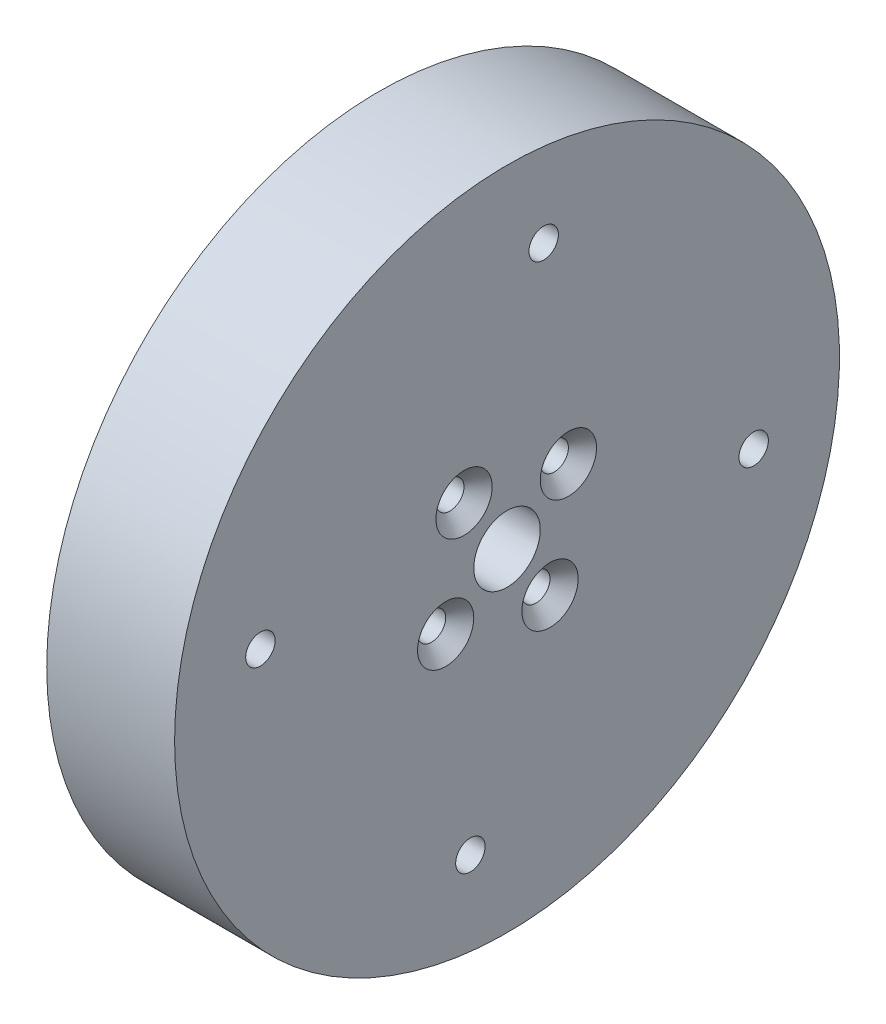
ISO-10303-21;
HEADER;
FILE_DESCRIPTION(('STEP AP214'),'2;1');
FILE_NAME('part.step','',(''),(''),'','','');
FILE_SCHEMA(('AUTOMOTIVE_DESIGN { 1 0 10303 214 1 1 1 1 }'));
ENDSEC;
DATA;
#1=APPLICATION_CONTEXT('core data for automotive mechanical design processes');
#2=APPLICATION_PROTOCOL_DEFINITION('international standard','automotive_design',2000,#1);
#3=PRODUCT_CONTEXT('',#1,'mechanical');
#4=PRODUCT('Part','Part','',(#3));
#5=PRODUCT_RELATED_PRODUCT_CATEGORY('part','',(#4));
#6=PRODUCT_DEFINITION_FORMATION('','',#4);
#7=PRODUCT_DEFINITION_CONTEXT('part definition',#1,'design');
#8=PRODUCT_DEFINITION('design','',#6,#7);
#9=PRODUCT_DEFINITION_SHAPE('','',#8);
#10=(LENGTH_UNIT() NAMED_UNIT(*) SI_UNIT(.MILLI.,.METRE.));
#11=(NAMED_UNIT(*) PLANE_ANGLE_UNIT() SI_UNIT($,.RADIAN.));
#12=(NAMED_UNIT(*) SI_UNIT($,.STERADIAN.) SOLID_ANGLE_UNIT());
#13=UNCERTAINTY_MEASURE_WITH_UNIT(LENGTH_MEASURE(1.E-05),#10,'distance_accuracy_value','');
#14=(GEOMETRIC_REPRESENTATION_CONTEXT(3) GLOBAL_UNCERTAINTY_ASSIGNED_CONTEXT((#13)) GLOBAL_UNIT_ASSIGNED_CONTEXT((#10,
#11,#12)) REPRESENTATION_CONTEXT('',''));
#15=CARTESIAN_POINT('',(0.,0.,0.));
#16=DIRECTION('',(0.,0.,1.));
#17=DIRECTION('',(1.,0.,0.));
#18=AXIS2_PLACEMENT_3D('',#15,#16,#17);
#19=CARTESIAN_POINT('',(0.,0.,0.));
#20=DIRECTION('',(-1.,0.,0.));
#21=DIRECTION('',(0.,0.,1.));
#22=AXIS2_PLACEMENT_3D('',#19,#20,#21);
#23=CYLINDRICAL_SURFACE('',#22,13.);
#24=CARTESIAN_POINT('',(5.,0.,0.));
#25=DIRECTION('',(-1.,0.,0.));
#26=DIRECTION('',(0.,0.,1.));
#27=AXIS2_PLACEMENT_3D('',#24,#25,#26);
#28=CIRCLE('',#27,13.);
#29=CARTESIAN_POINT('',(5.,0.,13.));
#30=VERTEX_POINT('',#29);
#31=EDGE_CURVE('E118',#30,#30,#28,.T.);
#32=ORIENTED_EDGE('',*,*,#31,.F.);
#33=EDGE_LOOP('',(#32));
#34=FACE_BOUND('',#33,.T.);
#35=CARTESIAN_POINT('',(0.,0.,0.));
#36=DIRECTION('',(-1.,0.,0.));
#37=DIRECTION('',(0.,0.,1.));
#38=AXIS2_PLACEMENT_3D('',#35,#36,#37);
#39=CIRCLE('',#38,13.);
#40=CARTESIAN_POINT('',(0.,0.,13.));
#41=VERTEX_POINT('',#40);
#42=EDGE_CURVE('E11',#41,#41,#39,.T.);
#43=ORIENTED_EDGE('',*,*,#42,.T.);
#44=EDGE_LOOP('',(#43));
#45=FACE_BOUND('',#44,.T.);
#46=ADVANCED_FACE('F36',(#34,#45),#23,.F.);
#47=CARTESIAN_POINT('',(0.,13.,0.));
#48=DIRECTION('',(1.,0.,0.));
#49=DIRECTION('',(0.,0.,-1.));
#50=AXIS2_PLACEMENT_3D('',#47,#48,#49);
#51=PLANE('',#50);
#52=ORIENTED_EDGE('',*,*,#42,.F.);
#53=EDGE_LOOP('',(#52));
#54=FACE_BOUND('',#53,.T.);
#55=CARTESIAN_POINT('',(0.,0.,0.));
#56=DIRECTION('',(-1.,0.,0.));
#57=DIRECTION('',(0.,0.,1.));
#58=AXIS2_PLACEMENT_3D('',#55,#56,#57);
#59=CIRCLE('',#58,26.);
#60=CARTESIAN_POINT('',(0.,0.,26.));
#61=VERTEX_POINT('',#60);
#62=EDGE_CURVE('E44',#61,#61,#59,.T.);
#63=ORIENTED_EDGE('',*,*,#62,.T.);
#64=EDGE_LOOP('',(#63));
#65=FACE_BOUND('',#64,.T.);
#66=ADVANCED_FACE('F158',(#54,#65),#51,.F.);
#67=CARTESIAN_POINT('',(0.,0.,0.));
#68=DIRECTION('',(-1.,0.,0.));
#69=DIRECTION('',(0.,0.,1.));
#70=AXIS2_PLACEMENT_3D('',#67,#68,#69);
#71=CYLINDRICAL_SURFACE('',#70,26.);
#72=ORIENTED_EDGE('',*,*,#62,.F.);
#73=EDGE_LOOP('',(#72));
#74=FACE_BOUND('',#73,.T.);
#75=CARTESIAN_POINT('',(10.,0.,0.));
#76=DIRECTION('',(-1.,0.,0.));
#77=DIRECTION('',(0.,0.,1.));
#78=AXIS2_PLACEMENT_3D('',#75,#76,#77);
#79=CIRCLE('',#78,26.);
#80=CARTESIAN_POINT('',(10.,0.,26.));
#81=VERTEX_POINT('',#80);
#82=EDGE_CURVE('E127',#81,#81,#79,.T.);
#83=ORIENTED_EDGE('',*,*,#82,.T.);
#84=EDGE_LOOP('',(#83));
#85=FACE_BOUND('',#84,.T.);
#86=ADVANCED_FACE('F163',(#74,#85),#71,.T.);
#87=CARTESIAN_POINT('',(10.,2.6,0.));
#88=DIRECTION('',(-1.,0.,0.));
#89=DIRECTION('',(0.,0.,1.));
#90=AXIS2_PLACEMENT_3D('',#87,#88,#89);
#91=PLANE('',#90);
#92=CARTESIAN_POINT('',(10.,19.28816947601,-2.86644697573742));
#93=DIRECTION('',(1.,0.,0.));
#94=DIRECTION('',(0.,0.,-1.));
#95=AXIS2_PLACEMENT_3D('',#92,#93,#94);
#96=CIRCLE('',#95,1.15);
#97=CARTESIAN_POINT('',(10.,19.28816947601,-4.01644697573742));
#98=VERTEX_POINT('',#97);
#99=EDGE_CURVE('E69',#98,#98,#96,.T.);
#100=ORIENTED_EDGE('',*,*,#99,.F.);
#101=EDGE_LOOP('',(#100));
#102=FACE_BOUND('',#101,.T.);
#103=CARTESIAN_POINT('',(10.,2.86644697573722,19.2881694760101));
#104=DIRECTION('',(1.,0.,0.));
#105=DIRECTION('',(0.,0.,-1.));
#106=AXIS2_PLACEMENT_3D('',#103,#104,#105);
#107=CIRCLE('',#106,1.15);
#108=CARTESIAN_POINT('',(10.,2.86644697573722,18.1381694760101));
#109=VERTEX_POINT('',#108);
#110=EDGE_CURVE('E68',#109,#109,#107,.T.);
#111=ORIENTED_EDGE('',*,*,#110,.F.);
#112=EDGE_LOOP('',(#111));
#113=FACE_BOUND('',#112,.T.);
#114=CARTESIAN_POINT('',(10.,-19.2881694760101,2.86644697573728));
#115=DIRECTION('',(1.,0.,0.));
#116=DIRECTION('',(0.,0.,-1.));
#117=AXIS2_PLACEMENT_3D('',#114,#115,#116);
#118=CIRCLE('',#117,1.15);
#119=CARTESIAN_POINT('',(10.,-19.2881694760101,1.71644697573728));
#120=VERTEX_POINT('',#119);
#121=EDGE_CURVE('E79',#120,#120,#118,.T.);
#122=ORIENTED_EDGE('',*,*,#121,.F.);
#123=EDGE_LOOP('',(#122));
#124=FACE_BOUND('',#123,.T.);
#125=CARTESIAN_POINT('',(10.,-2.86644697573722,-19.2881694760101));
#126=DIRECTION('',(1.,0.,0.));
#127=DIRECTION('',(0.,0.,-1.));
#128=AXIS2_PLACEMENT_3D('',#125,#126,#127);
#129=CIRCLE('',#128,1.15);
#130=CARTESIAN_POINT('',(10.,-2.86644697573722,-20.4381694760101));
#131=VERTEX_POINT('',#130);
#132=EDGE_CURVE('E85',#131,#131,#129,.T.);
#133=ORIENTED_EDGE('',*,*,#132,.F.);
#134=EDGE_LOOP('',(#133));
#135=FACE_BOUND('',#134,.T.);
#136=CARTESIAN_POINT('',(10.,-3.36265492454397,4.80000000000004));
#137=DIRECTION('',(1.,0.,0.));
#138=DIRECTION('',(0.,0.,-1.));
#139=AXIS2_PLACEMENT_3D('',#136,#137,#138);
#140=CIRCLE('',#139,2.2);
#141=CARTESIAN_POINT('',(10.,-3.36265492454397,2.60000000000003));
#142=VERTEX_POINT('',#141);
#143=EDGE_CURVE('E91',#142,#142,#140,.T.);
#144=ORIENTED_EDGE('',*,*,#143,.F.);
#145=EDGE_LOOP('',(#144));
#146=FACE_BOUND('',#145,.T.);
#147=CARTESIAN_POINT('',(10.,-4.8,-3.36265492454402));
#148=DIRECTION('',(1.,0.,0.));
#149=DIRECTION('',(0.,0.,-1.));
#150=AXIS2_PLACEMENT_3D('',#147,#148,#149);
#151=CIRCLE('',#150,2.2);
#152=CARTESIAN_POINT('',(10.,-4.8,-5.56265492454402));
#153=VERTEX_POINT('',#152);
#154=EDGE_CURVE('E97',#153,#153,#151,.T.);
#155=ORIENTED_EDGE('',*,*,#154,.F.);
#156=EDGE_LOOP('',(#155));
#157=FACE_BOUND('',#156,.T.);
#158=CARTESIAN_POINT('',(10.,3.362654924544,-4.80000000000001));
#159=DIRECTION('',(1.,0.,0.));
#160=DIRECTION('',(0.,0.,-1.));
#161=AXIS2_PLACEMENT_3D('',#158,#159,#160);
#162=CIRCLE('',#161,2.2);
#163=CARTESIAN_POINT('',(10.,3.362654924544,-7.00000000000001));
#164=VERTEX_POINT('',#163);
#165=EDGE_CURVE('E104',#164,#164,#162,.T.);
#166=ORIENTED_EDGE('',*,*,#165,.F.);
#167=EDGE_LOOP('',(#166));
#168=FACE_BOUND('',#167,.T.);
#169=CARTESIAN_POINT('',(10.,4.8,3.36265492454402));
#170=DIRECTION('',(1.,0.,0.));
#171=DIRECTION('',(0.,0.,-1.));
#172=AXIS2_PLACEMENT_3D('',#169,#170,#171);
#173=CIRCLE('',#172,2.2);
#174=CARTESIAN_POINT('',(10.,4.8,1.16265492454402));
#175=VERTEX_POINT('',#174);
#176=EDGE_CURVE('E111',#175,#175,#173,.T.);
#177=ORIENTED_EDGE('',*,*,#176,.F.);
#178=EDGE_LOOP('',(#177));
#179=FACE_BOUND('',#178,.T.);
#180=ORIENTED_EDGE('',*,*,#82,.F.);
#181=EDGE_LOOP('',(#180));
#182=FACE_BOUND('',#181,.T.);
#183=CARTESIAN_POINT('',(10.,0.,0.));
#184=DIRECTION('',(-1.,0.,0.));
#185=DIRECTION('',(0.,0.,1.));
#186=AXIS2_PLACEMENT_3D('',#183,#184,#185);
#187=CIRCLE('',#186,2.6);
#188=CARTESIAN_POINT('',(10.,0.,2.6));
#189=VERTEX_POINT('',#188);
#190=EDGE_CURVE('E124',#189,#189,#187,.T.);
#191=ORIENTED_EDGE('',*,*,#190,.T.);
#192=EDGE_LOOP('',(#191));
#193=FACE_BOUND('',#192,.T.);
#194=ADVANCED_FACE('F173',(#102,#113,#124,#135,#146,#157,#168,#179,#182,#193),#91,.F.);
#195=CARTESIAN_POINT('',(0.,0.,0.));
#196=DIRECTION('',(-1.,0.,0.));
#197=DIRECTION('',(0.,0.,1.));
#198=AXIS2_PLACEMENT_3D('',#195,#196,#197);
#199=CYLINDRICAL_SURFACE('',#198,2.6);
#200=ORIENTED_EDGE('',*,*,#190,.F.);
#201=EDGE_LOOP('',(#200));
#202=FACE_BOUND('',#201,.T.);
#203=CARTESIAN_POINT('',(5.,0.,0.));
#204=DIRECTION('',(-1.,0.,0.));
#205=DIRECTION('',(0.,0.,1.));
#206=AXIS2_PLACEMENT_3D('',#203,#204,#205);
#207=CIRCLE('',#206,2.6);
#208=CARTESIAN_POINT('',(5.,0.,2.6));
#209=VERTEX_POINT('',#208);
#210=EDGE_CURVE('E121',#209,#209,#207,.T.);
#211=ORIENTED_EDGE('',*,*,#210,.T.);
#212=EDGE_LOOP('',(#211));
#213=FACE_BOUND('',#212,.T.);
#214=ADVANCED_FACE('F179',(#202,#213),#199,.F.);
#215=CARTESIAN_POINT('',(5.,13.,0.));
#216=DIRECTION('',(1.,0.,0.));
#217=DIRECTION('',(0.,0.,-1.));
#218=AXIS2_PLACEMENT_3D('',#215,#216,#217);
#219=PLANE('',#218);
#220=CARTESIAN_POINT('',(5.,-3.36265492454397,4.80000000000004));
#221=DIRECTION('',(1.,0.,0.));
#222=DIRECTION('',(0.,0.,-1.));
#223=AXIS2_PLACEMENT_3D('',#220,#221,#222);
#224=CIRCLE('',#223,1.09999999999999);
#225=CARTESIAN_POINT('',(5.,-3.36265492454397,3.70000000000004));
#226=VERTEX_POINT('',#225);
#227=EDGE_CURVE('E39',#226,#226,#224,.T.);
#228=ORIENTED_EDGE('',*,*,#227,.T.);
#229=EDGE_LOOP('',(#228));
#230=FACE_BOUND('',#229,.T.);
#231=CARTESIAN_POINT('',(5.,-4.8,-3.36265492454402));
#232=DIRECTION('',(1.,0.,0.));
#233=DIRECTION('',(0.,0.,-1.));
#234=AXIS2_PLACEMENT_3D('',#231,#232,#233);
#235=CIRCLE('',#234,1.09999999999999);
#236=CARTESIAN_POINT('',(5.,-4.8,-4.46265492454401));
#237=VERTEX_POINT('',#236);
#238=EDGE_CURVE('E103',#237,#237,#235,.T.);
#239=ORIENTED_EDGE('',*,*,#238,.T.);
#240=EDGE_LOOP('',(#239));
#241=FACE_BOUND('',#240,.T.);
#242=CARTESIAN_POINT('',(5.,3.362654924544,-4.80000000000001));
#243=DIRECTION('',(1.,0.,0.));
#244=DIRECTION('',(0.,0.,-1.));
#245=AXIS2_PLACEMENT_3D('',#242,#243,#244);
#246=CIRCLE('',#245,1.09999999999999);
#247=CARTESIAN_POINT('',(5.,3.362654924544,-5.9));
#248=VERTEX_POINT('',#247);
#249=EDGE_CURVE('E110',#248,#248,#246,.T.);
#250=ORIENTED_EDGE('',*,*,#249,.T.);
#251=EDGE_LOOP('',(#250));
#252=FACE_BOUND('',#251,.T.);
#253=CARTESIAN_POINT('',(5.,4.8,3.36265492454402));
#254=DIRECTION('',(1.,0.,0.));
#255=DIRECTION('',(0.,0.,-1.));
#256=AXIS2_PLACEMENT_3D('',#253,#254,#255);
#257=CIRCLE('',#256,1.09999999999999);
#258=CARTESIAN_POINT('',(5.,4.8,2.26265492454402));
#259=VERTEX_POINT('',#258);
#260=EDGE_CURVE('E117',#259,#259,#257,.T.);
#261=ORIENTED_EDGE('',*,*,#260,.T.);
#262=EDGE_LOOP('',(#261));
#263=FACE_BOUND('',#262,.T.);
#264=ORIENTED_EDGE('',*,*,#210,.F.);
#265=EDGE_LOOP('',(#264));
#266=FACE_BOUND('',#265,.T.);
#267=ORIENTED_EDGE('',*,*,#31,.T.);
#268=EDGE_LOOP('',(#267));
#269=FACE_BOUND('',#268,.T.);
#270=ADVANCED_FACE('F138',(#230,#241,#252,#263,#266,#269),#219,.F.);
#271=CARTESIAN_POINT('',(10.,4.8,3.36265492454402));
#272=DIRECTION('',(1.,0.,0.));
#273=DIRECTION('',(0.,0.,-1.));
#274=AXIS2_PLACEMENT_3D('',#271,#272,#273);
#275=CYLINDRICAL_SURFACE('',#274,1.09999999999999);
#276=CARTESIAN_POINT('',(8.90000000000001,4.8,3.36265492454402));
#277=DIRECTION('',(1.,0.,0.));
#278=DIRECTION('',(0.,0.,-1.));
#279=AXIS2_PLACEMENT_3D('',#276,#277,#278);
#280=CIRCLE('',#279,1.09999999999999);
#281=CARTESIAN_POINT('',(8.90000000000001,4.8,2.26265492454403));
#282=VERTEX_POINT('',#281);
#283=EDGE_CURVE('E114',#282,#282,#280,.T.);
#284=ORIENTED_EDGE('',*,*,#283,.T.);
#285=EDGE_LOOP('',(#284));
#286=FACE_BOUND('',#285,.T.);
#287=ORIENTED_EDGE('',*,*,#260,.F.);
#288=EDGE_LOOP('',(#287));
#289=FACE_BOUND('',#288,.T.);
#290=ADVANCED_FACE('F191',(#286,#289),#275,.F.);
#291=CARTESIAN_POINT('',(10.,4.8,3.36265492454402));
#292=DIRECTION('',(1.,0.,0.));
#293=DIRECTION('',(0.,0.,-1.));
#294=AXIS2_PLACEMENT_3D('',#291,#292,#293);
#295=CONICAL_SURFACE('',#294,2.2,0.785398163397458);
#296=ORIENTED_EDGE('',*,*,#283,.F.);
#297=EDGE_LOOP('',(#296));
#298=FACE_BOUND('',#297,.T.);
#299=ORIENTED_EDGE('',*,*,#176,.T.);
#300=EDGE_LOOP('',(#299));
#301=FACE_BOUND('',#300,.T.);
#302=ADVANCED_FACE('F197',(#298,#301),#295,.F.);
#303=CARTESIAN_POINT('',(10.,3.362654924544,-4.80000000000001));
#304=DIRECTION('',(1.,0.,0.));
#305=DIRECTION('',(0.,0.,-1.));
#306=AXIS2_PLACEMENT_3D('',#303,#304,#305);
#307=CYLINDRICAL_SURFACE('',#306,1.09999999999999);
#308=CARTESIAN_POINT('',(8.90000000000001,3.362654924544,-4.80000000000001));
#309=DIRECTION('',(1.,0.,0.));
#310=DIRECTION('',(0.,0.,-1.));
#311=AXIS2_PLACEMENT_3D('',#308,#309,#310);
#312=CIRCLE('',#311,1.09999999999999);
#313=CARTESIAN_POINT('',(8.90000000000001,3.362654924544,-5.9));
#314=VERTEX_POINT('',#313);
#315=EDGE_CURVE('E107',#314,#314,#312,.T.);
#316=ORIENTED_EDGE('',*,*,#315,.T.);
#317=EDGE_LOOP('',(#316));
#318=FACE_BOUND('',#317,.T.);
#319=ORIENTED_EDGE('',*,*,#249,.F.);
#320=EDGE_LOOP('',(#319));
#321=FACE_BOUND('',#320,.T.);
#322=ADVANCED_FACE('F154',(#318,#321),#307,.F.);
#323=CARTESIAN_POINT('',(10.,3.362654924544,-4.80000000000001));
#324=DIRECTION('',(1.,0.,0.));
#325=DIRECTION('',(0.,0.,-1.));
#326=AXIS2_PLACEMENT_3D('',#323,#324,#325);
#327=CONICAL_SURFACE('',#326,2.2,0.785398163397458);
#328=ORIENTED_EDGE('',*,*,#315,.F.);
#329=EDGE_LOOP('',(#328));
#330=FACE_BOUND('',#329,.T.);
#331=ORIENTED_EDGE('',*,*,#165,.T.);
#332=EDGE_LOOP('',(#331));
#333=FACE_BOUND('',#332,.T.);
#334=ADVANCED_FACE('F144',(#330,#333),#327,.F.);
#335=CARTESIAN_POINT('',(10.,-4.8,-3.36265492454402));
#336=DIRECTION('',(1.,0.,0.));
#337=DIRECTION('',(0.,0.,-1.));
#338=AXIS2_PLACEMENT_3D('',#335,#336,#337);
#339=CYLINDRICAL_SURFACE('',#338,1.09999999999999);
#340=CARTESIAN_POINT('',(8.90000000000001,-4.8,-3.36265492454402));
#341=DIRECTION('',(1.,0.,0.));
#342=DIRECTION('',(0.,0.,-1.));
#343=AXIS2_PLACEMENT_3D('',#340,#341,#342);
#344=CIRCLE('',#343,1.09999999999999);
#345=CARTESIAN_POINT('',(8.90000000000001,-4.8,-4.46265492454401));
#346=VERTEX_POINT('',#345);
#347=EDGE_CURVE('E100',#346,#346,#344,.T.);
#348=ORIENTED_EDGE('',*,*,#347,.T.);
#349=EDGE_LOOP('',(#348));
#350=FACE_BOUND('',#349,.T.);
#351=ORIENTED_EDGE('',*,*,#238,.F.);
#352=EDGE_LOOP('',(#351));
#353=FACE_BOUND('',#352,.T.);
#354=ADVANCED_FACE('F141',(#350,#353),#339,.F.);
#355=CARTESIAN_POINT('',(10.,-4.8,-3.36265492454402));
#356=DIRECTION('',(1.,0.,0.));
#357=DIRECTION('',(0.,0.,-1.));
#358=AXIS2_PLACEMENT_3D('',#355,#356,#357);
#359=CONICAL_SURFACE('',#358,2.2,0.785398163397458);
#360=ORIENTED_EDGE('',*,*,#347,.F.);
#361=EDGE_LOOP('',(#360));
#362=FACE_BOUND('',#361,.T.);
#363=ORIENTED_EDGE('',*,*,#154,.T.);
#364=EDGE_LOOP('',(#363));
#365=FACE_BOUND('',#364,.T.);
#366=ADVANCED_FACE('F143',(#362,#365),#359,.F.);
#367=CARTESIAN_POINT('',(10.,-3.36265492454397,4.80000000000004));
#368=DIRECTION('',(1.,0.,0.));
#369=DIRECTION('',(0.,0.,-1.));
#370=AXIS2_PLACEMENT_3D('',#367,#368,#369);
#371=CYLINDRICAL_SURFACE('',#370,1.09999999999999);
#372=CARTESIAN_POINT('',(8.90000000000001,-3.36265492454397,4.80000000000004));
#373=DIRECTION('',(1.,0.,0.));
#374=DIRECTION('',(0.,0.,-1.));
#375=AXIS2_PLACEMENT_3D('',#372,#373,#374);
#376=CIRCLE('',#375,1.09999999999999);
#377=CARTESIAN_POINT('',(8.90000000000001,-3.36265492454397,3.70000000000005));
#378=VERTEX_POINT('',#377);
#379=EDGE_CURVE('E94',#378,#378,#376,.T.);
#380=ORIENTED_EDGE('',*,*,#379,.T.);
#381=EDGE_LOOP('',(#380));
#382=FACE_BOUND('',#381,.T.);
#383=ORIENTED_EDGE('',*,*,#227,.F.);
#384=EDGE_LOOP('',(#383));
#385=FACE_BOUND('',#384,.T.);
#386=ADVANCED_FACE('F151',(#382,#385),#371,.F.);
#387=CARTESIAN_POINT('',(10.,-3.36265492454397,4.80000000000004));
#388=DIRECTION('',(1.,0.,0.));
#389=DIRECTION('',(0.,0.,-1.));
#390=AXIS2_PLACEMENT_3D('',#387,#388,#389);
#391=CONICAL_SURFACE('',#390,2.2,0.785398163397458);
#392=ORIENTED_EDGE('',*,*,#379,.F.);
#393=EDGE_LOOP('',(#392));
#394=FACE_BOUND('',#393,.T.);
#395=ORIENTED_EDGE('',*,*,#143,.T.);
#396=EDGE_LOOP('',(#395));
#397=FACE_BOUND('',#396,.T.);
#398=ADVANCED_FACE('F246',(#394,#397),#391,.F.);
#399=CARTESIAN_POINT('',(7.,-2.86644697573722,-19.2881694760101));
#400=DIRECTION('',(1.,0.,0.));
#401=DIRECTION('',(0.,0.,-1.));
#402=AXIS2_PLACEMENT_3D('',#399,#400,#401);
#403=CONICAL_SURFACE('',#402,1.15,1.02974425867665);
#404=CARTESIAN_POINT('',(6.30901028811831,-2.86644697573722,-19.2881694760101));
#405=VERTEX_POINT('',#404);
#406=VERTEX_LOOP('',#405);
#407=FACE_BOUND('',#406,.T.);
#408=CARTESIAN_POINT('',(7.,-2.86644697573722,-19.2881694760101));
#409=DIRECTION('',(1.,0.,0.));
#410=DIRECTION('',(0.,0.,-1.));
#411=AXIS2_PLACEMENT_3D('',#408,#409,#410);
#412=CIRCLE('',#411,1.15);
#413=CARTESIAN_POINT('',(7.,-2.86644697573722,-20.4381694760101));
#414=VERTEX_POINT('',#413);
#415=EDGE_CURVE('E88',#414,#414,#412,.T.);
#416=ORIENTED_EDGE('',*,*,#415,.T.);
#417=EDGE_LOOP('',(#416));
#418=FACE_BOUND('',#417,.T.);
#419=ADVANCED_FACE('F256',(#407,#418),#403,.F.);
#420=CARTESIAN_POINT('',(10.,-2.86644697573722,-19.2881694760101));
#421=DIRECTION('',(1.,0.,0.));
#422=DIRECTION('',(0.,0.,-1.));
#423=AXIS2_PLACEMENT_3D('',#420,#421,#422);
#424=CYLINDRICAL_SURFACE('',#423,1.15);
#425=ORIENTED_EDGE('',*,*,#415,.F.);
#426=EDGE_LOOP('',(#425));
#427=FACE_BOUND('',#426,.T.);
#428=ORIENTED_EDGE('',*,*,#132,.T.);
#429=EDGE_LOOP('',(#428));
#430=FACE_BOUND('',#429,.T.);
#431=ADVANCED_FACE('F266',(#427,#430),#424,.F.);
#432=CARTESIAN_POINT('',(7.,-19.2881694760101,2.86644697573728));
#433=DIRECTION('',(1.,0.,0.));
#434=DIRECTION('',(0.,0.,-1.));
#435=AXIS2_PLACEMENT_3D('',#432,#433,#434);
#436=CONICAL_SURFACE('',#435,1.15,1.02974425867665);
#437=CARTESIAN_POINT('',(6.30901028811831,-19.2881694760101,2.86644697573728));
#438=VERTEX_POINT('',#437);
#439=VERTEX_LOOP('',#438);
#440=FACE_BOUND('',#439,.T.);
#441=CARTESIAN_POINT('',(7.,-19.2881694760101,2.86644697573728));
#442=DIRECTION('',(1.,0.,0.));
#443=DIRECTION('',(0.,0.,-1.));
#444=AXIS2_PLACEMENT_3D('',#441,#442,#443);
#445=CIRCLE('',#444,1.15);
#446=CARTESIAN_POINT('',(7.,-19.2881694760101,1.71644697573728));
#447=VERTEX_POINT('',#446);
#448=EDGE_CURVE('E82',#447,#447,#445,.T.);
#449=ORIENTED_EDGE('',*,*,#448,.T.);
#450=EDGE_LOOP('',(#449));
#451=FACE_BOUND('',#450,.T.);
#452=ADVANCED_FACE('F274',(#440,#451),#436,.F.);
#453=CARTESIAN_POINT('',(10.,-19.2881694760101,2.86644697573728));
#454=DIRECTION('',(1.,0.,0.));
#455=DIRECTION('',(0.,0.,-1.));
#456=AXIS2_PLACEMENT_3D('',#453,#454,#455);
#457=CYLINDRICAL_SURFACE('',#456,1.15);
#458=ORIENTED_EDGE('',*,*,#448,.F.);
#459=EDGE_LOOP('',(#458));
#460=FACE_BOUND('',#459,.T.);
#461=ORIENTED_EDGE('',*,*,#121,.T.);
#462=EDGE_LOOP('',(#461));
#463=FACE_BOUND('',#462,.T.);
#464=ADVANCED_FACE('F289',(#460,#463),#457,.F.);
#465=CARTESIAN_POINT('',(7.,2.86644697573722,19.2881694760101));
#466=DIRECTION('',(1.,0.,0.));
#467=DIRECTION('',(0.,0.,-1.));
#468=AXIS2_PLACEMENT_3D('',#465,#466,#467);
#469=CONICAL_SURFACE('',#468,1.15,1.02974425867665);
#470=CARTESIAN_POINT('',(6.30901028811831,2.86644697573721,19.2881694760101));
#471=VERTEX_POINT('',#470);
#472=VERTEX_LOOP('',#471);
#473=FACE_BOUND('',#472,.T.);
#474=CARTESIAN_POINT('',(7.,2.86644697573722,19.2881694760101));
#475=DIRECTION('',(1.,0.,0.));
#476=DIRECTION('',(0.,0.,-1.));
#477=AXIS2_PLACEMENT_3D('',#474,#475,#476);
#478=CIRCLE('',#477,1.15);
#479=CARTESIAN_POINT('',(7.,2.86644697573722,18.1381694760101));
#480=VERTEX_POINT('',#479);
#481=EDGE_CURVE('E72',#480,#480,#478,.T.);
#482=ORIENTED_EDGE('',*,*,#481,.T.);
#483=EDGE_LOOP('',(#482));
#484=FACE_BOUND('',#483,.T.);
#485=ADVANCED_FACE('F298',(#473,#484),#469,.F.);
#486=CARTESIAN_POINT('',(10.,2.86644697573722,19.2881694760101));
#487=DIRECTION('',(1.,0.,0.));
#488=DIRECTION('',(0.,0.,-1.));
#489=AXIS2_PLACEMENT_3D('',#486,#487,#488);
#490=CYLINDRICAL_SURFACE('',#489,1.15);
#491=ORIENTED_EDGE('',*,*,#481,.F.);
#492=EDGE_LOOP('',(#491));
#493=FACE_BOUND('',#492,.T.);
#494=ORIENTED_EDGE('',*,*,#110,.T.);
#495=EDGE_LOOP('',(#494));
#496=FACE_BOUND('',#495,.T.);
#497=ADVANCED_FACE('F62',(#493,#496),#490,.F.);
#498=CARTESIAN_POINT('',(7.,19.28816947601,-2.86644697573742));
#499=DIRECTION('',(1.,0.,0.));
#500=DIRECTION('',(0.,0.,-1.));
#501=AXIS2_PLACEMENT_3D('',#498,#499,#500);
#502=CONICAL_SURFACE('',#501,1.15,1.02974425867665);
#503=CARTESIAN_POINT('',(6.30901028811831,19.28816947601,-2.86644697573742));
#504=VERTEX_POINT('',#503);
#505=VERTEX_LOOP('',#504);
#506=FACE_BOUND('',#505,.T.);
#507=CARTESIAN_POINT('',(7.,19.28816947601,-2.86644697573742));
#508=DIRECTION('',(1.,0.,0.));
#509=DIRECTION('',(0.,0.,-1.));
#510=AXIS2_PLACEMENT_3D('',#507,#508,#509);
#511=CIRCLE('',#510,1.15);
#512=CARTESIAN_POINT('',(7.,19.28816947601,-4.01644697573742));
#513=VERTEX_POINT('',#512);
#514=EDGE_CURVE('E66',#513,#513,#511,.T.);
#515=ORIENTED_EDGE('',*,*,#514,.T.);
#516=EDGE_LOOP('',(#515));
#517=FACE_BOUND('',#516,.T.);
#518=ADVANCED_FACE('F58',(#506,#517),#502,.F.);
#519=CARTESIAN_POINT('',(10.,19.28816947601,-2.86644697573742));
#520=DIRECTION('',(1.,0.,0.));
#521=DIRECTION('',(0.,0.,-1.));
#522=AXIS2_PLACEMENT_3D('',#519,#520,#521);
#523=CYLINDRICAL_SURFACE('',#522,1.15);
#524=ORIENTED_EDGE('',*,*,#514,.F.);
#525=EDGE_LOOP('',(#524));
#526=FACE_BOUND('',#525,.T.);
#527=ORIENTED_EDGE('',*,*,#99,.T.);
#528=EDGE_LOOP('',(#527));
#529=FACE_BOUND('',#528,.T.);
#530=ADVANCED_FACE('F61',(#526,#529),#523,.F.);
#531=CLOSED_SHELL('',(#46,#66,#86,#194,#214,#270,#290,#302,#322,#334,#354,#366,#386,#398,#419,
#431,#452,#464,#485,#497,#518,#530));
#532=MANIFOLD_SOLID_BREP('B2',#531);
#533=ADVANCED_BREP_SHAPE_REPRESENTATION('',(#18,#532),#14);
#534=SHAPE_DEFINITION_REPRESENTATION(#9,#533);
ENDSEC;
END-ISO-10303-21;
